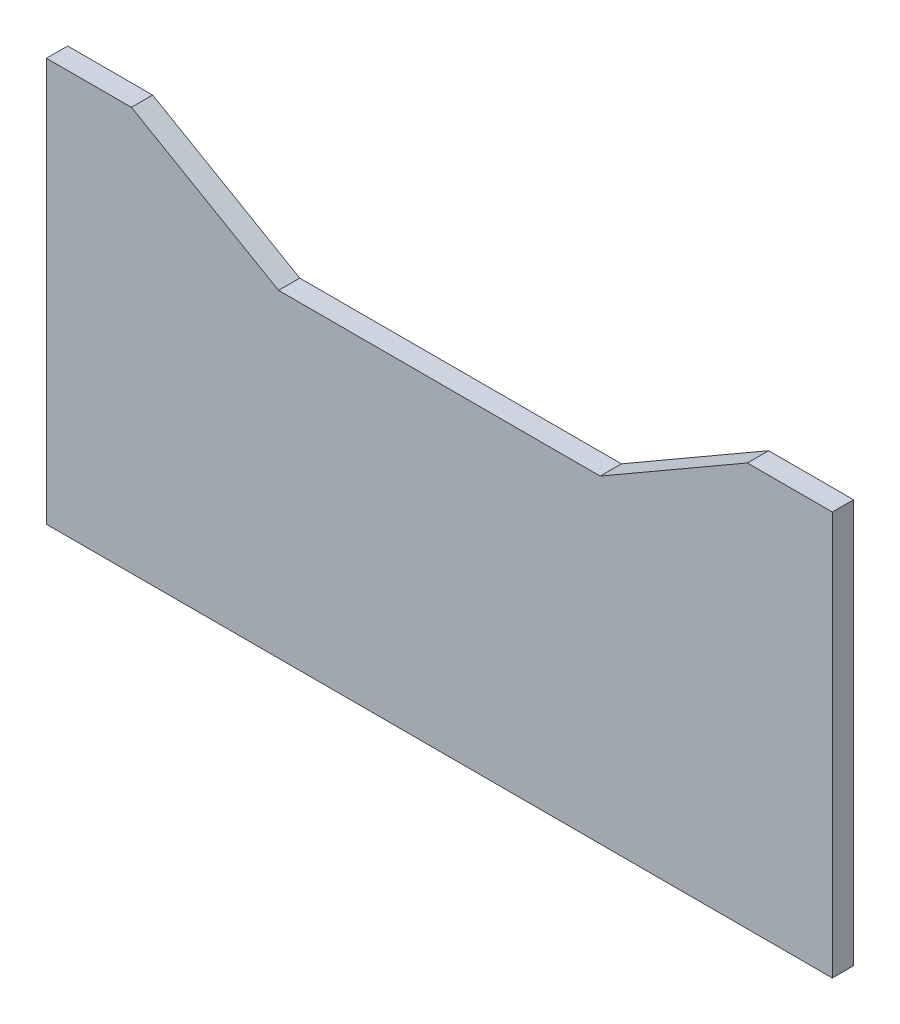
ISO-10303-21;
HEADER;
FILE_DESCRIPTION(('STEP AP214'),'2;1');
FILE_NAME('part.step','',(''),(''),'','','');
FILE_SCHEMA(('AUTOMOTIVE_DESIGN { 1 0 10303 214 1 1 1 1 }'));
ENDSEC;
DATA;
#1=APPLICATION_CONTEXT('core data for automotive mechanical design processes');
#2=APPLICATION_PROTOCOL_DEFINITION('international standard','automotive_design',2000,#1);
#3=PRODUCT_CONTEXT('',#1,'mechanical');
#4=PRODUCT('Part','Part','',(#3));
#5=PRODUCT_RELATED_PRODUCT_CATEGORY('part','',(#4));
#6=PRODUCT_DEFINITION_FORMATION('','',#4);
#7=PRODUCT_DEFINITION_CONTEXT('part definition',#1,'design');
#8=PRODUCT_DEFINITION('design','',#6,#7);
#9=PRODUCT_DEFINITION_SHAPE('','',#8);
#10=(LENGTH_UNIT() NAMED_UNIT(*) SI_UNIT(.MILLI.,.METRE.));
#11=(NAMED_UNIT(*) PLANE_ANGLE_UNIT() SI_UNIT($,.RADIAN.));
#12=(NAMED_UNIT(*) SI_UNIT($,.STERADIAN.) SOLID_ANGLE_UNIT());
#13=UNCERTAINTY_MEASURE_WITH_UNIT(LENGTH_MEASURE(1.E-05),#10,'distance_accuracy_value','');
#14=(GEOMETRIC_REPRESENTATION_CONTEXT(3) GLOBAL_UNCERTAINTY_ASSIGNED_CONTEXT((#13)) GLOBAL_UNIT_ASSIGNED_CONTEXT((#10,
#11,#12)) REPRESENTATION_CONTEXT('',''));
#15=CARTESIAN_POINT('',(0.,0.,0.));
#16=DIRECTION('',(0.,0.,1.));
#17=DIRECTION('',(1.,0.,0.));
#18=AXIS2_PLACEMENT_3D('',#15,#16,#17);
#19=CARTESIAN_POINT('',(0.,0.,10.));
#20=DIRECTION('',(1.,0.,0.));
#21=DIRECTION('',(0.,0.,-1.));
#22=AXIS2_PLACEMENT_3D('',#19,#20,#21);
#23=PLANE('',#22);
#24=DIRECTION('',(0.,-1.,0.));
#25=VECTOR('',#24,1.);
#26=CARTESIAN_POINT('',(0.,0.,0.));
#27=LINE('',#26,#25);
#28=CARTESIAN_POINT('',(0.,190.,0.));
#29=VERTEX_POINT('',#28);
#30=CARTESIAN_POINT('',(0.,0.,0.));
#31=VERTEX_POINT('',#30);
#32=EDGE_CURVE('E129',#29,#31,#27,.T.);
#33=ORIENTED_EDGE('',*,*,#32,.T.);
#34=DIRECTION('',(0.,0.,-1.));
#35=VECTOR('',#34,1.);
#36=CARTESIAN_POINT('',(0.,0.,10.));
#37=LINE('',#36,#35);
#38=CARTESIAN_POINT('',(0.,0.,10.));
#39=VERTEX_POINT('',#38);
#40=EDGE_CURVE('E11',#39,#31,#37,.T.);
#41=ORIENTED_EDGE('',*,*,#40,.F.);
#42=DIRECTION('',(0.,-1.,0.));
#43=VECTOR('',#42,1.);
#44=CARTESIAN_POINT('',(0.,0.,10.));
#45=LINE('',#44,#43);
#46=CARTESIAN_POINT('',(0.,190.,10.));
#47=VERTEX_POINT('',#46);
#48=EDGE_CURVE('E143',#47,#39,#45,.T.);
#49=ORIENTED_EDGE('',*,*,#48,.F.);
#50=DIRECTION('',(0.,0.,-1.));
#51=VECTOR('',#50,1.);
#52=CARTESIAN_POINT('',(0.,190.,10.));
#53=LINE('',#52,#51);
#54=EDGE_CURVE('E125',#47,#29,#53,.T.);
#55=ORIENTED_EDGE('',*,*,#54,.T.);
#56=EDGE_LOOP('',(#33,#41,#49,#55));
#57=FACE_BOUND('',#56,.T.);
#58=ADVANCED_FACE('F33',(#57),#23,.F.);
#59=CARTESIAN_POINT('',(0.,0.,10.));
#60=DIRECTION('',(0.,1.,0.));
#61=DIRECTION('',(0.,0.,1.));
#62=AXIS2_PLACEMENT_3D('',#59,#60,#61);
#63=PLANE('',#62);
#64=DIRECTION('',(1.,0.,0.));
#65=VECTOR('',#64,1.);
#66=CARTESIAN_POINT('',(0.,0.,0.));
#67=LINE('',#66,#65);
#68=CARTESIAN_POINT('',(370.,0.,0.));
#69=VERTEX_POINT('',#68);
#70=EDGE_CURVE('E132',#31,#69,#67,.T.);
#71=ORIENTED_EDGE('',*,*,#70,.T.);
#72=DIRECTION('',(0.,0.,-1.));
#73=VECTOR('',#72,1.);
#74=CARTESIAN_POINT('',(370.,0.,10.));
#75=LINE('',#74,#73);
#76=CARTESIAN_POINT('',(370.,0.,10.));
#77=VERTEX_POINT('',#76);
#78=EDGE_CURVE('E41',#77,#69,#75,.T.);
#79=ORIENTED_EDGE('',*,*,#78,.F.);
#80=DIRECTION('',(1.,0.,0.));
#81=VECTOR('',#80,1.);
#82=CARTESIAN_POINT('',(0.,0.,10.));
#83=LINE('',#82,#81);
#84=EDGE_CURVE('E92',#39,#77,#83,.T.);
#85=ORIENTED_EDGE('',*,*,#84,.F.);
#86=ORIENTED_EDGE('',*,*,#40,.T.);
#87=EDGE_LOOP('',(#71,#79,#85,#86));
#88=FACE_BOUND('',#87,.T.);
#89=ADVANCED_FACE('F178',(#88),#63,.F.);
#90=CARTESIAN_POINT('',(370.,0.,10.));
#91=DIRECTION('',(-1.,0.,0.));
#92=DIRECTION('',(0.,0.,1.));
#93=AXIS2_PLACEMENT_3D('',#90,#91,#92);
#94=PLANE('',#93);
#95=DIRECTION('',(0.,1.,0.));
#96=VECTOR('',#95,1.);
#97=CARTESIAN_POINT('',(370.,0.,0.));
#98=LINE('',#97,#96);
#99=CARTESIAN_POINT('',(370.,190.,0.));
#100=VERTEX_POINT('',#99);
#101=EDGE_CURVE('E134',#69,#100,#98,.T.);
#102=ORIENTED_EDGE('',*,*,#101,.T.);
#103=DIRECTION('',(0.,0.,-1.));
#104=VECTOR('',#103,1.);
#105=CARTESIAN_POINT('',(370.,190.,10.));
#106=LINE('',#105,#104);
#107=CARTESIAN_POINT('',(370.,190.,10.));
#108=VERTEX_POINT('',#107);
#109=EDGE_CURVE('E150',#108,#100,#106,.T.);
#110=ORIENTED_EDGE('',*,*,#109,.F.);
#111=DIRECTION('',(0.,1.,0.));
#112=VECTOR('',#111,1.);
#113=CARTESIAN_POINT('',(370.,0.,10.));
#114=LINE('',#113,#112);
#115=EDGE_CURVE('E158',#77,#108,#114,.T.);
#116=ORIENTED_EDGE('',*,*,#115,.F.);
#117=ORIENTED_EDGE('',*,*,#78,.T.);
#118=EDGE_LOOP('',(#102,#110,#116,#117));
#119=FACE_BOUND('',#118,.T.);
#120=ADVANCED_FACE('F156',(#119),#94,.F.);
#121=CARTESIAN_POINT('',(330.,190.,10.));
#122=DIRECTION('',(0.,-1.,0.));
#123=DIRECTION('',(0.,0.,-1.));
#124=AXIS2_PLACEMENT_3D('',#121,#122,#123);
#125=PLANE('',#124);
#126=DIRECTION('',(-1.,0.,0.));
#127=VECTOR('',#126,1.);
#128=CARTESIAN_POINT('',(330.,190.,0.));
#129=LINE('',#128,#127);
#130=CARTESIAN_POINT('',(330.,190.,0.));
#131=VERTEX_POINT('',#130);
#132=EDGE_CURVE('E136',#100,#131,#129,.T.);
#133=ORIENTED_EDGE('',*,*,#132,.T.);
#134=DIRECTION('',(0.,0.,-1.));
#135=VECTOR('',#134,1.);
#136=CARTESIAN_POINT('',(330.,190.,10.));
#137=LINE('',#136,#135);
#138=CARTESIAN_POINT('',(330.,190.,10.));
#139=VERTEX_POINT('',#138);
#140=EDGE_CURVE('E147',#139,#131,#137,.T.);
#141=ORIENTED_EDGE('',*,*,#140,.F.);
#142=DIRECTION('',(-1.,0.,0.));
#143=VECTOR('',#142,1.);
#144=CARTESIAN_POINT('',(330.,190.,10.));
#145=LINE('',#144,#143);
#146=EDGE_CURVE('E170',#108,#139,#145,.T.);
#147=ORIENTED_EDGE('',*,*,#146,.F.);
#148=ORIENTED_EDGE('',*,*,#109,.T.);
#149=EDGE_LOOP('',(#133,#141,#147,#148));
#150=FACE_BOUND('',#149,.T.);
#151=ADVANCED_FACE('F166',(#150),#125,.F.);
#152=CARTESIAN_POINT('',(330.,190.,10.));
#153=DIRECTION('',(0.499999999999995,-0.866025403784442,0.));
#154=DIRECTION('',(0.866025403784442,0.499999999999995,0.));
#155=AXIS2_PLACEMENT_3D('',#152,#153,#154);
#156=PLANE('',#155);
#157=DIRECTION('',(-0.866025403784442,-0.499999999999995,0.));
#158=VECTOR('',#157,1.);
#159=CARTESIAN_POINT('',(330.,190.,0.));
#160=LINE('',#159,#158);
#161=CARTESIAN_POINT('',(260.717967697244,150.,0.));
#162=VERTEX_POINT('',#161);
#163=EDGE_CURVE('E138',#131,#162,#160,.T.);
#164=ORIENTED_EDGE('',*,*,#163,.T.);
#165=DIRECTION('',(0.,0.,-1.));
#166=VECTOR('',#165,1.);
#167=CARTESIAN_POINT('',(260.717967697244,150.,10.));
#168=LINE('',#167,#166);
#169=CARTESIAN_POINT('',(260.717967697244,150.,10.));
#170=VERTEX_POINT('',#169);
#171=EDGE_CURVE('E120',#170,#162,#168,.T.);
#172=ORIENTED_EDGE('',*,*,#171,.F.);
#173=DIRECTION('',(-0.866025403784442,-0.499999999999995,0.));
#174=VECTOR('',#173,1.);
#175=CARTESIAN_POINT('',(330.,190.,10.));
#176=LINE('',#175,#174);
#177=EDGE_CURVE('E111',#139,#170,#176,.T.);
#178=ORIENTED_EDGE('',*,*,#177,.F.);
#179=ORIENTED_EDGE('',*,*,#140,.T.);
#180=EDGE_LOOP('',(#164,#172,#178,#179));
#181=FACE_BOUND('',#180,.T.);
#182=ADVANCED_FACE('F169',(#181),#156,.F.);
#183=CARTESIAN_POINT('',(260.717967697244,150.,10.));
#184=DIRECTION('',(0.,-1.,0.));
#185=DIRECTION('',(1.,0.,0.));
#186=AXIS2_PLACEMENT_3D('',#183,#184,#185);
#187=PLANE('',#186);
#188=DIRECTION('',(-1.,0.,0.));
#189=VECTOR('',#188,1.);
#190=CARTESIAN_POINT('',(260.717967697244,150.,0.));
#191=LINE('',#190,#189);
#192=CARTESIAN_POINT('',(109.282032302756,150.,0.));
#193=VERTEX_POINT('',#192);
#194=EDGE_CURVE('E119',#162,#193,#191,.T.);
#195=ORIENTED_EDGE('',*,*,#194,.T.);
#196=DIRECTION('',(0.,0.,-1.));
#197=VECTOR('',#196,1.);
#198=CARTESIAN_POINT('',(109.282032302756,150.,10.));
#199=LINE('',#198,#197);
#200=CARTESIAN_POINT('',(109.282032302756,150.,10.));
#201=VERTEX_POINT('',#200);
#202=EDGE_CURVE('E116',#201,#193,#199,.T.);
#203=ORIENTED_EDGE('',*,*,#202,.F.);
#204=DIRECTION('',(-1.,0.,0.));
#205=VECTOR('',#204,1.);
#206=CARTESIAN_POINT('',(260.717967697244,150.,10.));
#207=LINE('',#206,#205);
#208=EDGE_CURVE('E105',#170,#201,#207,.T.);
#209=ORIENTED_EDGE('',*,*,#208,.F.);
#210=ORIENTED_EDGE('',*,*,#171,.T.);
#211=EDGE_LOOP('',(#195,#203,#209,#210));
#212=FACE_BOUND('',#211,.T.);
#213=ADVANCED_FACE('F117',(#212),#187,.F.);
#214=CARTESIAN_POINT('',(40.,190.,10.));
#215=DIRECTION('',(-0.499999999999995,-0.866025403784442,0.));
#216=DIRECTION('',(0.866025403784442,-0.499999999999995,0.));
#217=AXIS2_PLACEMENT_3D('',#214,#215,#216);
#218=PLANE('',#217);
#219=DIRECTION('',(-0.866025403784442,0.499999999999995,0.));
#220=VECTOR('',#219,1.);
#221=CARTESIAN_POINT('',(40.,190.,0.));
#222=LINE('',#221,#220);
#223=CARTESIAN_POINT('',(40.,190.,0.));
#224=VERTEX_POINT('',#223);
#225=EDGE_CURVE('E78',#193,#224,#222,.T.);
#226=ORIENTED_EDGE('',*,*,#225,.T.);
#227=DIRECTION('',(0.,0.,-1.));
#228=VECTOR('',#227,1.);
#229=CARTESIAN_POINT('',(40.,190.,10.));
#230=LINE('',#229,#228);
#231=CARTESIAN_POINT('',(40.,190.,10.));
#232=VERTEX_POINT('',#231);
#233=EDGE_CURVE('E121',#232,#224,#230,.T.);
#234=ORIENTED_EDGE('',*,*,#233,.F.);
#235=DIRECTION('',(-0.866025403784442,0.499999999999995,0.));
#236=VECTOR('',#235,1.);
#237=CARTESIAN_POINT('',(40.,190.,10.));
#238=LINE('',#237,#236);
#239=EDGE_CURVE('E109',#201,#232,#238,.T.);
#240=ORIENTED_EDGE('',*,*,#239,.F.);
#241=ORIENTED_EDGE('',*,*,#202,.T.);
#242=EDGE_LOOP('',(#226,#234,#240,#241));
#243=FACE_BOUND('',#242,.T.);
#244=ADVANCED_FACE('F123',(#243),#218,.F.);
#245=CARTESIAN_POINT('',(40.,190.,10.));
#246=DIRECTION('',(0.,-1.,0.));
#247=DIRECTION('',(0.,0.,-1.));
#248=AXIS2_PLACEMENT_3D('',#245,#246,#247);
#249=PLANE('',#248);
#250=DIRECTION('',(-1.,0.,0.));
#251=VECTOR('',#250,1.);
#252=CARTESIAN_POINT('',(40.,190.,0.));
#253=LINE('',#252,#251);
#254=EDGE_CURVE('E84',#224,#29,#253,.T.);
#255=ORIENTED_EDGE('',*,*,#254,.T.);
#256=ORIENTED_EDGE('',*,*,#54,.F.);
#257=DIRECTION('',(-1.,0.,0.));
#258=VECTOR('',#257,1.);
#259=CARTESIAN_POINT('',(40.,190.,10.));
#260=LINE('',#259,#258);
#261=EDGE_CURVE('E49',#232,#47,#260,.T.);
#262=ORIENTED_EDGE('',*,*,#261,.F.);
#263=ORIENTED_EDGE('',*,*,#233,.T.);
#264=EDGE_LOOP('',(#255,#256,#262,#263));
#265=FACE_BOUND('',#264,.T.);
#266=ADVANCED_FACE('F194',(#265),#249,.F.);
#267=CARTESIAN_POINT('',(0.,0.,10.));
#268=DIRECTION('',(0.,0.,1.));
#269=DIRECTION('',(1.,0.,0.));
#270=AXIS2_PLACEMENT_3D('',#267,#268,#269);
#271=PLANE('',#270);
#272=ORIENTED_EDGE('',*,*,#48,.T.);
#273=ORIENTED_EDGE('',*,*,#84,.T.);
#274=ORIENTED_EDGE('',*,*,#115,.T.);
#275=ORIENTED_EDGE('',*,*,#146,.T.);
#276=ORIENTED_EDGE('',*,*,#177,.T.);
#277=ORIENTED_EDGE('',*,*,#208,.T.);
#278=ORIENTED_EDGE('',*,*,#239,.T.);
#279=ORIENTED_EDGE('',*,*,#261,.T.);
#280=EDGE_LOOP('',(#272,#273,#274,#275,#276,#277,#278,#279));
#281=FACE_BOUND('',#280,.T.);
#282=ADVANCED_FACE('F107',(#281),#271,.T.);
#283=CARTESIAN_POINT('',(0.,0.,0.));
#284=DIRECTION('',(0.,0.,1.));
#285=DIRECTION('',(1.,0.,0.));
#286=AXIS2_PLACEMENT_3D('',#283,#284,#285);
#287=PLANE('',#286);
#288=ORIENTED_EDGE('',*,*,#32,.F.);
#289=ORIENTED_EDGE('',*,*,#254,.F.);
#290=ORIENTED_EDGE('',*,*,#225,.F.);
#291=ORIENTED_EDGE('',*,*,#194,.F.);
#292=ORIENTED_EDGE('',*,*,#163,.F.);
#293=ORIENTED_EDGE('',*,*,#132,.F.);
#294=ORIENTED_EDGE('',*,*,#101,.F.);
#295=ORIENTED_EDGE('',*,*,#70,.F.);
#296=EDGE_LOOP('',(#288,#289,#290,#291,#292,#293,#294,#295));
#297=FACE_BOUND('',#296,.T.);
#298=ADVANCED_FACE('F162',(#297),#287,.F.);
#299=CLOSED_SHELL('',(#58,#89,#120,#151,#182,#213,#244,#266,#282,#298));
#300=MANIFOLD_SOLID_BREP('B2',#299);
#301=ADVANCED_BREP_SHAPE_REPRESENTATION('',(#18,#300),#14);
#302=SHAPE_DEFINITION_REPRESENTATION(#9,#301);
ENDSEC;
END-ISO-10303-21;
